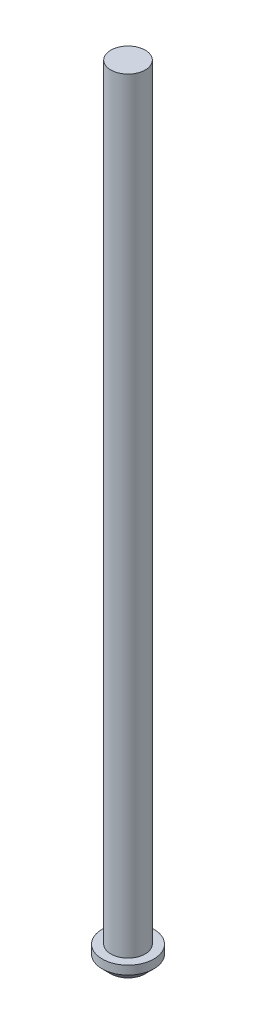
ISO-10303-21;
HEADER;
FILE_DESCRIPTION(('STEP AP214'),'2;1');
FILE_NAME('part.step','',(''),(''),'','','');
FILE_SCHEMA(('AUTOMOTIVE_DESIGN { 1 0 10303 214 1 1 1 1 }'));
ENDSEC;
DATA;
#1=APPLICATION_CONTEXT('core data for automotive mechanical design processes');
#2=APPLICATION_PROTOCOL_DEFINITION('international standard','automotive_design',2000,#1);
#3=PRODUCT_CONTEXT('',#1,'mechanical');
#4=PRODUCT('Part','Part','',(#3));
#5=PRODUCT_RELATED_PRODUCT_CATEGORY('part','',(#4));
#6=PRODUCT_DEFINITION_FORMATION('','',#4);
#7=PRODUCT_DEFINITION_CONTEXT('part definition',#1,'design');
#8=PRODUCT_DEFINITION('design','',#6,#7);
#9=PRODUCT_DEFINITION_SHAPE('','',#8);
#10=(LENGTH_UNIT() NAMED_UNIT(*) SI_UNIT(.MILLI.,.METRE.));
#11=(NAMED_UNIT(*) PLANE_ANGLE_UNIT() SI_UNIT($,.RADIAN.));
#12=(NAMED_UNIT(*) SI_UNIT($,.STERADIAN.) SOLID_ANGLE_UNIT());
#13=UNCERTAINTY_MEASURE_WITH_UNIT(LENGTH_MEASURE(1.E-05),#10,'distance_accuracy_value','');
#14=(GEOMETRIC_REPRESENTATION_CONTEXT(3) GLOBAL_UNCERTAINTY_ASSIGNED_CONTEXT((#13)) GLOBAL_UNIT_ASSIGNED_CONTEXT((#10,
#11,#12)) REPRESENTATION_CONTEXT('',''));
#15=CARTESIAN_POINT('',(0.,0.,0.));
#16=DIRECTION('',(0.,0.,1.));
#17=DIRECTION('',(1.,0.,0.));
#18=AXIS2_PLACEMENT_3D('',#15,#16,#17);
#19=CARTESIAN_POINT('',(0.,89.,0.));
#20=DIRECTION('',(0.,-1.,0.));
#21=DIRECTION('',(0.,0.,-1.));
#22=AXIS2_PLACEMENT_3D('',#19,#20,#21);
#23=CYLINDRICAL_SURFACE('',#22,2.);
#24=CARTESIAN_POINT('',(0.,89.,0.));
#25=DIRECTION('',(0.,1.,0.));
#26=DIRECTION('',(0.,0.,1.));
#27=AXIS2_PLACEMENT_3D('',#24,#25,#26);
#28=CIRCLE('',#27,2.);
#29=CARTESIAN_POINT('',(0.,89.,2.));
#30=VERTEX_POINT('',#29);
#31=EDGE_CURVE('E59',#30,#30,#28,.T.);
#32=ORIENTED_EDGE('',*,*,#31,.F.);
#33=EDGE_LOOP('',(#32));
#34=FACE_BOUND('',#33,.T.);
#35=CARTESIAN_POINT('',(0.,0.,0.));
#36=DIRECTION('',(0.,1.,0.));
#37=DIRECTION('',(0.,0.,1.));
#38=AXIS2_PLACEMENT_3D('',#35,#36,#37);
#39=CIRCLE('',#38,2.);
#40=CARTESIAN_POINT('',(0.,0.,2.));
#41=VERTEX_POINT('',#40);
#42=EDGE_CURVE('E64',#41,#41,#39,.T.);
#43=ORIENTED_EDGE('',*,*,#42,.T.);
#44=EDGE_LOOP('',(#43));
#45=FACE_BOUND('',#44,.T.);
#46=ADVANCED_FACE('F45',(#34,#45),#23,.T.);
#47=CARTESIAN_POINT('',(0.,89.,0.));
#48=DIRECTION('',(0.,1.,0.));
#49=DIRECTION('',(0.,0.,1.));
#50=AXIS2_PLACEMENT_3D('',#47,#48,#49);
#51=PLANE('',#50);
#52=ORIENTED_EDGE('',*,*,#31,.T.);
#53=EDGE_LOOP('',(#52));
#54=FACE_BOUND('',#53,.T.);
#55=ADVANCED_FACE('F93',(#54),#51,.T.);
#56=CARTESIAN_POINT('',(0.,-2.,0.));
#57=DIRECTION('',(0.,1.,0.));
#58=DIRECTION('',(0.,0.,1.));
#59=AXIS2_PLACEMENT_3D('',#56,#57,#58);
#60=CYLINDRICAL_SURFACE('',#59,3.);
#61=CARTESIAN_POINT('',(0.,-0.99999999999999,0.));
#62=DIRECTION('',(0.,-1.,0.));
#63=DIRECTION('',(0.,0.,-1.));
#64=AXIS2_PLACEMENT_3D('',#61,#62,#63);
#65=CIRCLE('',#64,3.);
#66=CARTESIAN_POINT('',(0.,-0.99999999999999,-3.));
#67=VERTEX_POINT('',#66);
#68=EDGE_CURVE('E10',#67,#67,#65,.F.);
#69=ORIENTED_EDGE('',*,*,#68,.T.);
#70=EDGE_LOOP('',(#69));
#71=FACE_BOUND('',#70,.T.);
#72=CARTESIAN_POINT('',(0.,0.,0.));
#73=DIRECTION('',(0.,-1.,0.));
#74=DIRECTION('',(0.,0.,-1.));
#75=AXIS2_PLACEMENT_3D('',#72,#73,#74);
#76=CIRCLE('',#75,3.);
#77=CARTESIAN_POINT('',(0.,0.,-3.));
#78=VERTEX_POINT('',#77);
#79=EDGE_CURVE('E69',#78,#78,#76,.T.);
#80=ORIENTED_EDGE('',*,*,#79,.T.);
#81=EDGE_LOOP('',(#80));
#82=FACE_BOUND('',#81,.T.);
#83=ADVANCED_FACE('F75',(#71,#82),#60,.T.);
#84=CARTESIAN_POINT('',(0.,-2.,0.));
#85=DIRECTION('',(0.,-1.,0.));
#86=DIRECTION('',(0.,0.,-1.));
#87=AXIS2_PLACEMENT_3D('',#84,#85,#86);
#88=PLANE('',#87);
#89=CARTESIAN_POINT('',(0.,-2.,0.));
#90=DIRECTION('',(0.,-1.,0.));
#91=DIRECTION('',(0.,0.,-1.));
#92=AXIS2_PLACEMENT_3D('',#89,#90,#91);
#93=CIRCLE('',#92,2.);
#94=CARTESIAN_POINT('',(0.,-2.,-2.));
#95=VERTEX_POINT('',#94);
#96=EDGE_CURVE('E54',#95,#95,#93,.T.);
#97=ORIENTED_EDGE('',*,*,#96,.T.);
#98=EDGE_LOOP('',(#97));
#99=FACE_BOUND('',#98,.T.);
#100=ADVANCED_FACE('F79',(#99),#88,.T.);
#101=CARTESIAN_POINT('',(0.,0.,0.));
#102=DIRECTION('',(0.,-1.,0.));
#103=DIRECTION('',(0.,0.,-1.));
#104=AXIS2_PLACEMENT_3D('',#101,#102,#103);
#105=PLANE('',#104);
#106=ORIENTED_EDGE('',*,*,#42,.F.);
#107=EDGE_LOOP('',(#106));
#108=FACE_BOUND('',#107,.T.);
#109=ORIENTED_EDGE('',*,*,#79,.F.);
#110=EDGE_LOOP('',(#109));
#111=FACE_BOUND('',#110,.T.);
#112=ADVANCED_FACE('F77',(#108,#111),#105,.F.);
#113=CARTESIAN_POINT('',(0.,-2.,0.));
#114=DIRECTION('',(0.,1.,0.));
#115=DIRECTION('',(0.,0.,1.));
#116=AXIS2_PLACEMENT_3D('',#113,#114,#115);
#117=CONICAL_SURFACE('',#116,2.,0.785398163397443);
#118=ORIENTED_EDGE('',*,*,#68,.F.);
#119=EDGE_LOOP('',(#118));
#120=FACE_BOUND('',#119,.T.);
#121=ORIENTED_EDGE('',*,*,#96,.F.);
#122=EDGE_LOOP('',(#121));
#123=FACE_BOUND('',#122,.T.);
#124=ADVANCED_FACE('F48',(#120,#123),#117,.T.);
#125=CLOSED_SHELL('',(#46,#55,#83,#100,#112,#124));
#126=MANIFOLD_SOLID_BREP('B2',#125);
#127=ADVANCED_BREP_SHAPE_REPRESENTATION('',(#18,#126),#14);
#128=SHAPE_DEFINITION_REPRESENTATION(#9,#127);
ENDSEC;
END-ISO-10303-21;
